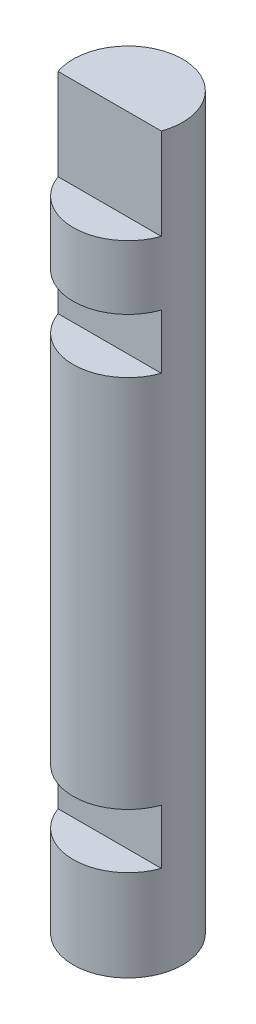
ISO-10303-21;
HEADER;
FILE_DESCRIPTION(('STEP AP214'),'2;1');
FILE_NAME('part.step','',(''),(''),'','','');
FILE_SCHEMA(('AUTOMOTIVE_DESIGN { 1 0 10303 214 1 1 1 1 }'));
ENDSEC;
DATA;
#1=APPLICATION_CONTEXT('core data for automotive mechanical design processes');
#2=APPLICATION_PROTOCOL_DEFINITION('international standard','automotive_design',2000,#1);
#3=PRODUCT_CONTEXT('',#1,'mechanical');
#4=PRODUCT('Part','Part','',(#3));
#5=PRODUCT_RELATED_PRODUCT_CATEGORY('part','',(#4));
#6=PRODUCT_DEFINITION_FORMATION('','',#4);
#7=PRODUCT_DEFINITION_CONTEXT('part definition',#1,'design');
#8=PRODUCT_DEFINITION('design','',#6,#7);
#9=PRODUCT_DEFINITION_SHAPE('','',#8);
#10=(LENGTH_UNIT() NAMED_UNIT(*) SI_UNIT(.MILLI.,.METRE.));
#11=(NAMED_UNIT(*) PLANE_ANGLE_UNIT() SI_UNIT($,.RADIAN.));
#12=(NAMED_UNIT(*) SI_UNIT($,.STERADIAN.) SOLID_ANGLE_UNIT());
#13=UNCERTAINTY_MEASURE_WITH_UNIT(LENGTH_MEASURE(1.E-05),#10,'distance_accuracy_value','');
#14=(GEOMETRIC_REPRESENTATION_CONTEXT(3) GLOBAL_UNCERTAINTY_ASSIGNED_CONTEXT((#13)) GLOBAL_UNIT_ASSIGNED_CONTEXT((#10,
#11,#12)) REPRESENTATION_CONTEXT('',''));
#15=CARTESIAN_POINT('',(0.,0.,0.));
#16=DIRECTION('',(0.,0.,1.));
#17=DIRECTION('',(1.,0.,0.));
#18=AXIS2_PLACEMENT_3D('',#15,#16,#17);
#19=CARTESIAN_POINT('',(0.,20.,0.));
#20=DIRECTION('',(0.,-1.,0.));
#21=DIRECTION('',(0.,0.,-1.));
#22=AXIS2_PLACEMENT_3D('',#19,#20,#21);
#23=CYLINDRICAL_SURFACE('',#22,3.);
#24=DIRECTION('',(0.,-1.,0.));
#25=VECTOR('',#24,1.);
#26=CARTESIAN_POINT('',(-2.82842712474619,20.,1.));
#27=LINE('',#26,#25);
#28=CARTESIAN_POINT('',(-2.82842712474619,-12.,1.));
#29=VERTEX_POINT('',#28);
#30=CARTESIAN_POINT('',(-2.82842712474619,-15.,1.));
#31=VERTEX_POINT('',#30);
#32=EDGE_CURVE('E113',#29,#31,#27,.T.);
#33=ORIENTED_EDGE('',*,*,#32,.F.);
#34=CARTESIAN_POINT('',(0.,-12.,0.));
#35=DIRECTION('',(0.,-1.,0.));
#36=DIRECTION('',(0.,0.,-1.));
#37=AXIS2_PLACEMENT_3D('',#34,#35,#36);
#38=CIRCLE('',#37,3.);
#39=CARTESIAN_POINT('',(2.82842712474619,-12.,1.));
#40=VERTEX_POINT('',#39);
#41=EDGE_CURVE('E102',#40,#29,#38,.T.);
#42=ORIENTED_EDGE('',*,*,#41,.F.);
#43=DIRECTION('',(0.,-1.,0.));
#44=VECTOR('',#43,1.);
#45=CARTESIAN_POINT('',(2.82842712474619,20.,1.));
#46=LINE('',#45,#44);
#47=CARTESIAN_POINT('',(2.82842712474619,-15.,1.));
#48=VERTEX_POINT('',#47);
#49=EDGE_CURVE('E98',#48,#40,#46,.F.);
#50=ORIENTED_EDGE('',*,*,#49,.F.);
#51=CARTESIAN_POINT('',(0.,-15.,0.));
#52=DIRECTION('',(0.,1.,0.));
#53=DIRECTION('',(0.,0.,1.));
#54=AXIS2_PLACEMENT_3D('',#51,#52,#53);
#55=CIRCLE('',#54,3.);
#56=EDGE_CURVE('E114',#31,#48,#55,.T.);
#57=ORIENTED_EDGE('',*,*,#56,.F.);
#58=EDGE_LOOP('',(#33,#42,#50,#57));
#59=FACE_BOUND('',#58,.T.);
#60=CARTESIAN_POINT('',(0.,-20.,0.));
#61=DIRECTION('',(0.,1.,0.));
#62=DIRECTION('',(0.,0.,1.));
#63=AXIS2_PLACEMENT_3D('',#60,#61,#62);
#64=CIRCLE('',#63,3.);
#65=CARTESIAN_POINT('',(0.,-20.,3.));
#66=VERTEX_POINT('',#65);
#67=EDGE_CURVE('E157',#66,#66,#64,.T.);
#68=ORIENTED_EDGE('',*,*,#67,.T.);
#69=EDGE_LOOP('',(#68));
#70=FACE_BOUND('',#69,.T.);
#71=DIRECTION('',(0.,-1.,0.));
#72=VECTOR('',#71,1.);
#73=CARTESIAN_POINT('',(-2.82842712474619,20.,0.999999999999999));
#74=LINE('',#73,#72);
#75=CARTESIAN_POINT('',(-2.82842712474619,20.,0.999999999999999));
#76=VERTEX_POINT('',#75);
#77=CARTESIAN_POINT('',(-2.82842712474619,15.,1.));
#78=VERTEX_POINT('',#77);
#79=EDGE_CURVE('E154',#76,#78,#74,.T.);
#80=ORIENTED_EDGE('',*,*,#79,.F.);
#81=CARTESIAN_POINT('',(0.,20.,0.));
#82=DIRECTION('',(0.,-1.,0.));
#83=DIRECTION('',(0.,0.,-1.));
#84=AXIS2_PLACEMENT_3D('',#81,#82,#83);
#85=CIRCLE('',#84,3.);
#86=CARTESIAN_POINT('',(2.82842712474619,20.,0.999999999999999));
#87=VERTEX_POINT('',#86);
#88=EDGE_CURVE('E161',#87,#76,#85,.F.);
#89=ORIENTED_EDGE('',*,*,#88,.F.);
#90=DIRECTION('',(0.,-1.,0.));
#91=VECTOR('',#90,1.);
#92=CARTESIAN_POINT('',(2.82842712474619,20.,0.999999999999999));
#93=LINE('',#92,#91);
#94=CARTESIAN_POINT('',(2.82842712474619,15.,1.));
#95=VERTEX_POINT('',#94);
#96=EDGE_CURVE('E146',#95,#87,#93,.F.);
#97=ORIENTED_EDGE('',*,*,#96,.F.);
#98=CARTESIAN_POINT('',(0.,15.,0.));
#99=DIRECTION('',(0.,1.,0.));
#100=DIRECTION('',(0.,0.,1.));
#101=AXIS2_PLACEMENT_3D('',#98,#99,#100);
#102=CIRCLE('',#101,3.);
#103=EDGE_CURVE('E106',#78,#95,#102,.T.);
#104=ORIENTED_EDGE('',*,*,#103,.F.);
#105=EDGE_LOOP('',(#80,#89,#97,#104));
#106=FACE_BOUND('',#105,.T.);
#107=DIRECTION('',(0.,-1.,0.));
#108=VECTOR('',#107,1.);
#109=CARTESIAN_POINT('',(-2.82842712474619,20.,1.));
#110=LINE('',#109,#108);
#111=CARTESIAN_POINT('',(-2.82842712474619,11.5,1.));
#112=VERTEX_POINT('',#111);
#113=CARTESIAN_POINT('',(-2.82842712474619,8.5,1.));
#114=VERTEX_POINT('',#113);
#115=EDGE_CURVE('E11',#112,#114,#110,.T.);
#116=ORIENTED_EDGE('',*,*,#115,.F.);
#117=CARTESIAN_POINT('',(0.,11.5,0.));
#118=DIRECTION('',(0.,-1.,0.));
#119=DIRECTION('',(0.,0.,-1.));
#120=AXIS2_PLACEMENT_3D('',#117,#118,#119);
#121=CIRCLE('',#120,3.);
#122=CARTESIAN_POINT('',(2.82842712474619,11.5,1.));
#123=VERTEX_POINT('',#122);
#124=EDGE_CURVE('E129',#123,#112,#121,.T.);
#125=ORIENTED_EDGE('',*,*,#124,.F.);
#126=DIRECTION('',(0.,-1.,0.));
#127=VECTOR('',#126,1.);
#128=CARTESIAN_POINT('',(2.82842712474619,20.,1.));
#129=LINE('',#128,#127);
#130=CARTESIAN_POINT('',(2.82842712474619,8.5,1.));
#131=VERTEX_POINT('',#130);
#132=EDGE_CURVE('E124',#131,#123,#129,.F.);
#133=ORIENTED_EDGE('',*,*,#132,.F.);
#134=CARTESIAN_POINT('',(0.,8.5,0.));
#135=DIRECTION('',(0.,1.,0.));
#136=DIRECTION('',(-1.,0.,0.));
#137=AXIS2_PLACEMENT_3D('',#134,#135,#136);
#138=CIRCLE('',#137,3.);
#139=EDGE_CURVE('E52',#114,#131,#138,.T.);
#140=ORIENTED_EDGE('',*,*,#139,.F.);
#141=EDGE_LOOP('',(#116,#125,#133,#140));
#142=FACE_BOUND('',#141,.T.);
#143=ADVANCED_FACE('F44',(#59,#70,#106,#142),#23,.T.);
#144=CARTESIAN_POINT('',(0.,20.,0.));
#145=DIRECTION('',(0.,1.,0.));
#146=DIRECTION('',(0.,0.,1.));
#147=AXIS2_PLACEMENT_3D('',#144,#145,#146);
#148=PLANE('',#147);
#149=DIRECTION('',(-1.,0.,0.));
#150=VECTOR('',#149,1.);
#151=CARTESIAN_POINT('',(-3.87442607463391,20.,1.));
#152=LINE('',#151,#150);
#153=EDGE_CURVE('E168',#87,#76,#152,.T.);
#154=ORIENTED_EDGE('',*,*,#153,.F.);
#155=ORIENTED_EDGE('',*,*,#88,.T.);
#156=EDGE_LOOP('',(#154,#155));
#157=FACE_BOUND('',#156,.T.);
#158=ADVANCED_FACE('F173',(#157),#148,.T.);
#159=CARTESIAN_POINT('',(0.,-20.,0.));
#160=DIRECTION('',(0.,1.,0.));
#161=DIRECTION('',(0.,0.,1.));
#162=AXIS2_PLACEMENT_3D('',#159,#160,#161);
#163=PLANE('',#162);
#164=ORIENTED_EDGE('',*,*,#67,.F.);
#165=EDGE_LOOP('',(#164));
#166=FACE_BOUND('',#165,.T.);
#167=ADVANCED_FACE('F183',(#166),#163,.F.);
#168=CARTESIAN_POINT('',(0.,15.,0.));
#169=DIRECTION('',(0.,1.,0.));
#170=DIRECTION('',(0.,0.,1.));
#171=AXIS2_PLACEMENT_3D('',#168,#169,#170);
#172=PLANE('',#171);
#173=ORIENTED_EDGE('',*,*,#103,.T.);
#174=DIRECTION('',(-1.,0.,0.));
#175=VECTOR('',#174,1.);
#176=CARTESIAN_POINT('',(-3.87442607463391,15.,1.));
#177=LINE('',#176,#175);
#178=EDGE_CURVE('E141',#95,#78,#177,.T.);
#179=ORIENTED_EDGE('',*,*,#178,.T.);
#180=EDGE_LOOP('',(#173,#179));
#181=FACE_BOUND('',#180,.T.);
#182=ADVANCED_FACE('F185',(#181),#172,.T.);
#183=CARTESIAN_POINT('',(-3.87442607463391,20.000012,1.));
#184=DIRECTION('',(0.,0.,1.));
#185=DIRECTION('',(1.,0.,0.));
#186=AXIS2_PLACEMENT_3D('',#183,#184,#185);
#187=PLANE('',#186);
#188=ORIENTED_EDGE('',*,*,#79,.T.);
#189=ORIENTED_EDGE('',*,*,#178,.F.);
#190=ORIENTED_EDGE('',*,*,#96,.T.);
#191=ORIENTED_EDGE('',*,*,#153,.T.);
#192=EDGE_LOOP('',(#188,#189,#190,#191));
#193=FACE_BOUND('',#192,.T.);
#194=ADVANCED_FACE('F179',(#193),#187,.T.);
#195=CARTESIAN_POINT('',(-3.,-15.,11.));
#196=DIRECTION('',(0.,1.,0.));
#197=DIRECTION('',(0.,0.,1.));
#198=AXIS2_PLACEMENT_3D('',#195,#196,#197);
#199=PLANE('',#198);
#200=ORIENTED_EDGE('',*,*,#56,.T.);
#201=DIRECTION('',(1.,0.,0.));
#202=VECTOR('',#201,1.);
#203=CARTESIAN_POINT('',(-3.,-15.,1.));
#204=LINE('',#203,#202);
#205=EDGE_CURVE('E70',#31,#48,#204,.T.);
#206=ORIENTED_EDGE('',*,*,#205,.F.);
#207=EDGE_LOOP('',(#200,#206));
#208=FACE_BOUND('',#207,.T.);
#209=ADVANCED_FACE('F188',(#208),#199,.T.);
#210=CARTESIAN_POINT('',(-3.,-12.,11.));
#211=DIRECTION('',(0.,-1.,0.));
#212=DIRECTION('',(0.,0.,-1.));
#213=AXIS2_PLACEMENT_3D('',#210,#211,#212);
#214=PLANE('',#213);
#215=ORIENTED_EDGE('',*,*,#41,.T.);
#216=DIRECTION('',(-1.,0.,0.));
#217=VECTOR('',#216,1.);
#218=CARTESIAN_POINT('',(-3.,-12.,1.));
#219=LINE('',#218,#217);
#220=EDGE_CURVE('E100',#40,#29,#219,.T.);
#221=ORIENTED_EDGE('',*,*,#220,.F.);
#222=EDGE_LOOP('',(#215,#221));
#223=FACE_BOUND('',#222,.T.);
#224=ADVANCED_FACE('F107',(#223),#214,.T.);
#225=CARTESIAN_POINT('',(0.,0.,1.));
#226=DIRECTION('',(0.,0.,1.));
#227=DIRECTION('',(1.,0.,0.));
#228=AXIS2_PLACEMENT_3D('',#225,#226,#227);
#229=PLANE('',#228);
#230=ORIENTED_EDGE('',*,*,#32,.T.);
#231=ORIENTED_EDGE('',*,*,#205,.T.);
#232=ORIENTED_EDGE('',*,*,#49,.T.);
#233=ORIENTED_EDGE('',*,*,#220,.T.);
#234=EDGE_LOOP('',(#230,#231,#232,#233));
#235=FACE_BOUND('',#234,.T.);
#236=ADVANCED_FACE('F96',(#235),#229,.T.);
#237=CARTESIAN_POINT('',(-3.,8.5,11.));
#238=DIRECTION('',(0.,1.,0.));
#239=DIRECTION('',(-1.,0.,0.));
#240=AXIS2_PLACEMENT_3D('',#237,#238,#239);
#241=PLANE('',#240);
#242=ORIENTED_EDGE('',*,*,#139,.T.);
#243=DIRECTION('',(1.,0.,0.));
#244=VECTOR('',#243,1.);
#245=CARTESIAN_POINT('',(-3.,8.5,1.));
#246=LINE('',#245,#244);
#247=EDGE_CURVE('E56',#114,#131,#246,.T.);
#248=ORIENTED_EDGE('',*,*,#247,.F.);
#249=EDGE_LOOP('',(#242,#248));
#250=FACE_BOUND('',#249,.T.);
#251=ADVANCED_FACE('F135',(#250),#241,.T.);
#252=CARTESIAN_POINT('',(-3.,11.5,11.));
#253=DIRECTION('',(0.,-1.,0.));
#254=DIRECTION('',(0.,0.,-1.));
#255=AXIS2_PLACEMENT_3D('',#252,#253,#254);
#256=PLANE('',#255);
#257=ORIENTED_EDGE('',*,*,#124,.T.);
#258=DIRECTION('',(-1.,0.,0.));
#259=VECTOR('',#258,1.);
#260=CARTESIAN_POINT('',(-3.,11.5,1.));
#261=LINE('',#260,#259);
#262=EDGE_CURVE('E137',#123,#112,#261,.T.);
#263=ORIENTED_EDGE('',*,*,#262,.F.);
#264=EDGE_LOOP('',(#257,#263));
#265=FACE_BOUND('',#264,.T.);
#266=ADVANCED_FACE('F142',(#265),#256,.T.);
#267=CARTESIAN_POINT('',(0.,0.,1.));
#268=DIRECTION('',(0.,0.,1.));
#269=DIRECTION('',(1.,0.,0.));
#270=AXIS2_PLACEMENT_3D('',#267,#268,#269);
#271=PLANE('',#270);
#272=ORIENTED_EDGE('',*,*,#115,.T.);
#273=ORIENTED_EDGE('',*,*,#247,.T.);
#274=ORIENTED_EDGE('',*,*,#132,.T.);
#275=ORIENTED_EDGE('',*,*,#262,.T.);
#276=EDGE_LOOP('',(#272,#273,#274,#275));
#277=FACE_BOUND('',#276,.T.);
#278=ADVANCED_FACE('F138',(#277),#271,.T.);
#279=CLOSED_SHELL('',(#143,#158,#167,#182,#194,#209,#224,#236,#251,#266,#278));
#280=MANIFOLD_SOLID_BREP('B2',#279);
#281=ADVANCED_BREP_SHAPE_REPRESENTATION('',(#18,#280),#14);
#282=SHAPE_DEFINITION_REPRESENTATION(#9,#281);
ENDSEC;
END-ISO-10303-21;
